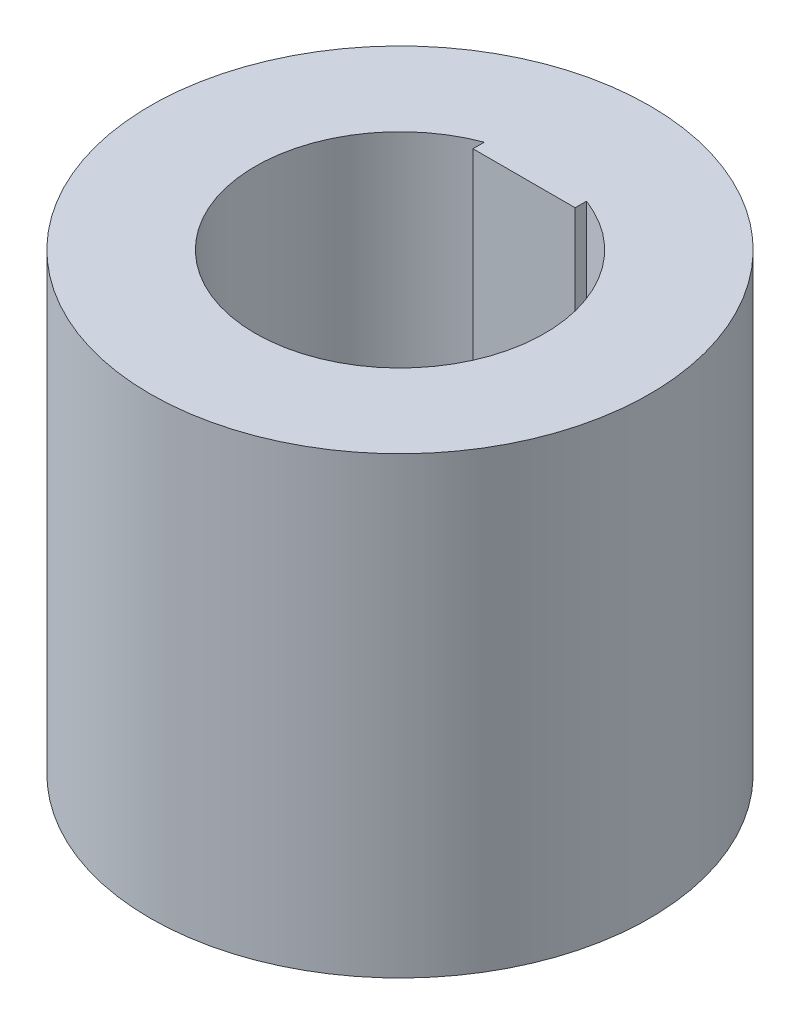
ISO-10303-21;
HEADER;
FILE_DESCRIPTION(('STEP AP214'),'2;1');
FILE_NAME('part.step','',(''),(''),'','','');
FILE_SCHEMA(('AUTOMOTIVE_DESIGN { 1 0 10303 214 1 1 1 1 }'));
ENDSEC;
DATA;
#1=APPLICATION_CONTEXT('core data for automotive mechanical design processes');
#2=APPLICATION_PROTOCOL_DEFINITION('international standard','automotive_design',2000,#1);
#3=PRODUCT_CONTEXT('',#1,'mechanical');
#4=PRODUCT('Part','Part','',(#3));
#5=PRODUCT_RELATED_PRODUCT_CATEGORY('part','',(#4));
#6=PRODUCT_DEFINITION_FORMATION('','',#4);
#7=PRODUCT_DEFINITION_CONTEXT('part definition',#1,'design');
#8=PRODUCT_DEFINITION('design','',#6,#7);
#9=PRODUCT_DEFINITION_SHAPE('','',#8);
#10=(LENGTH_UNIT() NAMED_UNIT(*) SI_UNIT(.MILLI.,.METRE.));
#11=(NAMED_UNIT(*) PLANE_ANGLE_UNIT() SI_UNIT($,.RADIAN.));
#12=(NAMED_UNIT(*) SI_UNIT($,.STERADIAN.) SOLID_ANGLE_UNIT());
#13=UNCERTAINTY_MEASURE_WITH_UNIT(LENGTH_MEASURE(1.E-05),#10,'distance_accuracy_value','');
#14=(GEOMETRIC_REPRESENTATION_CONTEXT(3) GLOBAL_UNCERTAINTY_ASSIGNED_CONTEXT((#13)) GLOBAL_UNIT_ASSIGNED_CONTEXT((#10,
#11,#12)) REPRESENTATION_CONTEXT('',''));
#15=CARTESIAN_POINT('',(0.,0.,0.));
#16=DIRECTION('',(0.,0.,1.));
#17=DIRECTION('',(1.,0.,0.));
#18=AXIS2_PLACEMENT_3D('',#15,#16,#17);
#19=CARTESIAN_POINT('',(0.900000000000001,4.,0.));
#20=DIRECTION('',(1.,0.,0.));
#21=DIRECTION('',(0.,0.,-1.));
#22=AXIS2_PLACEMENT_3D('',#19,#20,#21);
#23=PLANE('',#22);
#24=DIRECTION('',(0.,0.,1.));
#25=VECTOR('',#24,1.);
#26=CARTESIAN_POINT('',(0.900000000000001,-4.,0.));
#27=LINE('',#26,#25);
#28=CARTESIAN_POINT('',(0.9,-4.,-2.38589605808803));
#29=VERTEX_POINT('',#28);
#30=CARTESIAN_POINT('',(0.9,-4.,-2.18589605808803));
#31=VERTEX_POINT('',#30);
#32=EDGE_CURVE('E117',#29,#31,#27,.T.);
#33=ORIENTED_EDGE('',*,*,#32,.F.);
#34=DIRECTION('',(0.,-1.,0.));
#35=VECTOR('',#34,1.);
#36=CARTESIAN_POINT('',(0.9,4.,-2.38589605808803));
#37=LINE('',#36,#35);
#38=CARTESIAN_POINT('',(0.9,4.,-2.38589605808803));
#39=VERTEX_POINT('',#38);
#40=EDGE_CURVE('E11',#39,#29,#37,.T.);
#41=ORIENTED_EDGE('',*,*,#40,.F.);
#42=DIRECTION('',(0.,0.,1.));
#43=VECTOR('',#42,1.);
#44=CARTESIAN_POINT('',(0.900000000000001,4.,0.));
#45=LINE('',#44,#43);
#46=CARTESIAN_POINT('',(0.9,4.,-2.18589605808803));
#47=VERTEX_POINT('',#46);
#48=EDGE_CURVE('E104',#39,#47,#45,.T.);
#49=ORIENTED_EDGE('',*,*,#48,.T.);
#50=DIRECTION('',(0.,-1.,0.));
#51=VECTOR('',#50,1.);
#52=CARTESIAN_POINT('',(0.9,4.,-2.18589605808803));
#53=LINE('',#52,#51);
#54=EDGE_CURVE('E82',#47,#31,#53,.T.);
#55=ORIENTED_EDGE('',*,*,#54,.T.);
#56=EDGE_LOOP('',(#33,#41,#49,#55));
#57=FACE_BOUND('',#56,.T.);
#58=ADVANCED_FACE('F43',(#57),#23,.T.);
#59=CARTESIAN_POINT('',(0.,4.,0.));
#60=DIRECTION('',(0.,-1.,0.));
#61=DIRECTION('',(0.,0.,-1.));
#62=AXIS2_PLACEMENT_3D('',#59,#60,#61);
#63=CYLINDRICAL_SURFACE('',#62,2.55);
#64=CARTESIAN_POINT('',(0.,-4.,0.));
#65=DIRECTION('',(0.,1.,0.));
#66=DIRECTION('',(0.,0.,1.));
#67=AXIS2_PLACEMENT_3D('',#64,#65,#66);
#68=CIRCLE('',#67,2.55);
#69=CARTESIAN_POINT('',(-0.9,-4.,-2.38589605808803));
#70=VERTEX_POINT('',#69);
#71=EDGE_CURVE('E95',#70,#29,#68,.T.);
#72=ORIENTED_EDGE('',*,*,#71,.F.);
#73=DIRECTION('',(0.,-1.,0.));
#74=VECTOR('',#73,1.);
#75=CARTESIAN_POINT('',(-0.9,4.,-2.38589605808803));
#76=LINE('',#75,#74);
#77=CARTESIAN_POINT('',(-0.9,4.,-2.38589605808803));
#78=VERTEX_POINT('',#77);
#79=EDGE_CURVE('E52',#78,#70,#76,.T.);
#80=ORIENTED_EDGE('',*,*,#79,.F.);
#81=CARTESIAN_POINT('',(0.,4.,0.));
#82=DIRECTION('',(0.,1.,0.));
#83=DIRECTION('',(0.,0.,1.));
#84=AXIS2_PLACEMENT_3D('',#81,#82,#83);
#85=CIRCLE('',#84,2.55);
#86=EDGE_CURVE('E93',#78,#39,#85,.T.);
#87=ORIENTED_EDGE('',*,*,#86,.T.);
#88=ORIENTED_EDGE('',*,*,#40,.T.);
#89=EDGE_LOOP('',(#72,#80,#87,#88));
#90=FACE_BOUND('',#89,.T.);
#91=ADVANCED_FACE('F91',(#90),#63,.F.);
#92=CARTESIAN_POINT('',(-0.900000000000001,4.,0.));
#93=DIRECTION('',(1.,0.,0.));
#94=DIRECTION('',(0.,0.,-1.));
#95=AXIS2_PLACEMENT_3D('',#92,#93,#94);
#96=PLANE('',#95);
#97=DIRECTION('',(0.,0.,1.));
#98=VECTOR('',#97,1.);
#99=CARTESIAN_POINT('',(-0.900000000000001,-4.,0.));
#100=LINE('',#99,#98);
#101=CARTESIAN_POINT('',(-0.9,-4.,-2.18589605808803));
#102=VERTEX_POINT('',#101);
#103=EDGE_CURVE('E75',#70,#102,#100,.T.);
#104=ORIENTED_EDGE('',*,*,#103,.T.);
#105=DIRECTION('',(0.,-1.,0.));
#106=VECTOR('',#105,1.);
#107=CARTESIAN_POINT('',(-0.9,4.,-2.18589605808803));
#108=LINE('',#107,#106);
#109=CARTESIAN_POINT('',(-0.9,4.,-2.18589605808803));
#110=VERTEX_POINT('',#109);
#111=EDGE_CURVE('E97',#110,#102,#108,.T.);
#112=ORIENTED_EDGE('',*,*,#111,.F.);
#113=DIRECTION('',(0.,0.,1.));
#114=VECTOR('',#113,1.);
#115=CARTESIAN_POINT('',(-0.900000000000001,4.,0.));
#116=LINE('',#115,#114);
#117=EDGE_CURVE('E98',#78,#110,#116,.T.);
#118=ORIENTED_EDGE('',*,*,#117,.F.);
#119=ORIENTED_EDGE('',*,*,#79,.T.);
#120=EDGE_LOOP('',(#104,#112,#118,#119));
#121=FACE_BOUND('',#120,.T.);
#122=ADVANCED_FACE('F99',(#121),#96,.F.);
#123=CARTESIAN_POINT('',(0.,4.,-2.18589605808803));
#124=DIRECTION('',(0.,0.,-1.));
#125=DIRECTION('',(-1.,0.,0.));
#126=AXIS2_PLACEMENT_3D('',#123,#124,#125);
#127=PLANE('',#126);
#128=DIRECTION('',(1.,0.,0.));
#129=VECTOR('',#128,1.);
#130=CARTESIAN_POINT('',(0.,-4.,-2.18589605808803));
#131=LINE('',#130,#129);
#132=EDGE_CURVE('E125',#102,#31,#131,.T.);
#133=ORIENTED_EDGE('',*,*,#132,.T.);
#134=ORIENTED_EDGE('',*,*,#54,.F.);
#135=DIRECTION('',(1.,0.,0.));
#136=VECTOR('',#135,1.);
#137=CARTESIAN_POINT('',(0.,4.,-2.18589605808803));
#138=LINE('',#137,#136);
#139=EDGE_CURVE('E60',#110,#47,#138,.T.);
#140=ORIENTED_EDGE('',*,*,#139,.F.);
#141=ORIENTED_EDGE('',*,*,#111,.T.);
#142=EDGE_LOOP('',(#133,#134,#140,#141));
#143=FACE_BOUND('',#142,.T.);
#144=ADVANCED_FACE('F136',(#143),#127,.F.);
#145=CARTESIAN_POINT('',(0.,4.,0.));
#146=DIRECTION('',(0.,-1.,0.));
#147=DIRECTION('',(0.,0.,-1.));
#148=AXIS2_PLACEMENT_3D('',#145,#146,#147);
#149=CYLINDRICAL_SURFACE('',#148,4.4);
#150=CARTESIAN_POINT('',(0.,4.,0.));
#151=DIRECTION('',(0.,1.,0.));
#152=DIRECTION('',(0.,0.,1.));
#153=AXIS2_PLACEMENT_3D('',#150,#151,#152);
#154=CIRCLE('',#153,4.4);
#155=CARTESIAN_POINT('',(0.,4.,4.4));
#156=VERTEX_POINT('',#155);
#157=EDGE_CURVE('E113',#156,#156,#154,.T.);
#158=ORIENTED_EDGE('',*,*,#157,.F.);
#159=EDGE_LOOP('',(#158));
#160=FACE_BOUND('',#159,.T.);
#161=CARTESIAN_POINT('',(0.,-4.,0.));
#162=DIRECTION('',(0.,1.,0.));
#163=DIRECTION('',(0.,0.,1.));
#164=AXIS2_PLACEMENT_3D('',#161,#162,#163);
#165=CIRCLE('',#164,4.4);
#166=CARTESIAN_POINT('',(0.,-4.,4.4));
#167=VERTEX_POINT('',#166);
#168=EDGE_CURVE('E108',#167,#167,#165,.T.);
#169=ORIENTED_EDGE('',*,*,#168,.T.);
#170=EDGE_LOOP('',(#169));
#171=FACE_BOUND('',#170,.T.);
#172=ADVANCED_FACE('F151',(#160,#171),#149,.T.);
#173=CARTESIAN_POINT('',(0.,4.,0.));
#174=DIRECTION('',(0.,1.,0.));
#175=DIRECTION('',(0.,0.,1.));
#176=AXIS2_PLACEMENT_3D('',#173,#174,#175);
#177=PLANE('',#176);
#178=ORIENTED_EDGE('',*,*,#48,.F.);
#179=ORIENTED_EDGE('',*,*,#86,.F.);
#180=ORIENTED_EDGE('',*,*,#117,.T.);
#181=ORIENTED_EDGE('',*,*,#139,.T.);
#182=EDGE_LOOP('',(#178,#179,#180,#181));
#183=FACE_BOUND('',#182,.T.);
#184=ORIENTED_EDGE('',*,*,#157,.T.);
#185=EDGE_LOOP('',(#184));
#186=FACE_BOUND('',#185,.T.);
#187=ADVANCED_FACE('F102',(#183,#186),#177,.T.);
#188=CARTESIAN_POINT('',(0.,-4.,0.));
#189=DIRECTION('',(0.,1.,0.));
#190=DIRECTION('',(0.,0.,1.));
#191=AXIS2_PLACEMENT_3D('',#188,#189,#190);
#192=PLANE('',#191);
#193=ORIENTED_EDGE('',*,*,#32,.T.);
#194=ORIENTED_EDGE('',*,*,#132,.F.);
#195=ORIENTED_EDGE('',*,*,#103,.F.);
#196=ORIENTED_EDGE('',*,*,#71,.T.);
#197=EDGE_LOOP('',(#193,#194,#195,#196));
#198=FACE_BOUND('',#197,.T.);
#199=ORIENTED_EDGE('',*,*,#168,.F.);
#200=EDGE_LOOP('',(#199));
#201=FACE_BOUND('',#200,.T.);
#202=ADVANCED_FACE('F138',(#198,#201),#192,.F.);
#203=CLOSED_SHELL('',(#58,#91,#122,#144,#172,#187,#202));
#204=MANIFOLD_SOLID_BREP('B2',#203);
#205=ADVANCED_BREP_SHAPE_REPRESENTATION('',(#18,#204),#14);
#206=SHAPE_DEFINITION_REPRESENTATION(#9,#205);
ENDSEC;
END-ISO-10303-21;
